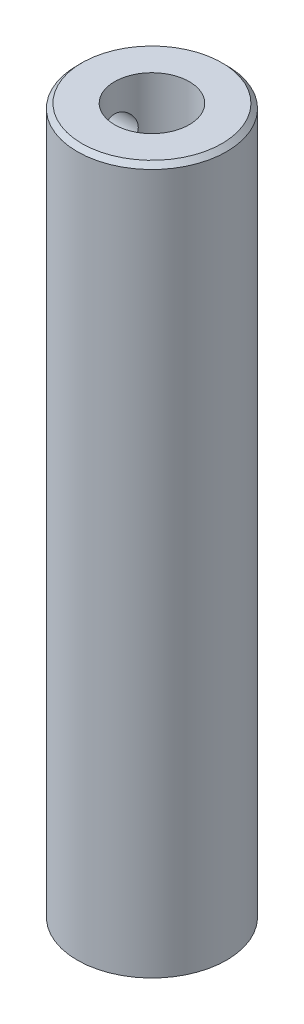
ISO-10303-21;
HEADER;
FILE_DESCRIPTION(('STEP AP214'),'2;1');
FILE_NAME('part.step','',(''),(''),'','','');
FILE_SCHEMA(('AUTOMOTIVE_DESIGN { 1 0 10303 214 1 1 1 1 }'));
ENDSEC;
DATA;
#1=APPLICATION_CONTEXT('core data for automotive mechanical design processes');
#2=APPLICATION_PROTOCOL_DEFINITION('international standard','automotive_design',2000,#1);
#3=PRODUCT_CONTEXT('',#1,'mechanical');
#4=PRODUCT('Part','Part','',(#3));
#5=PRODUCT_RELATED_PRODUCT_CATEGORY('part','',(#4));
#6=PRODUCT_DEFINITION_FORMATION('','',#4);
#7=PRODUCT_DEFINITION_CONTEXT('part definition',#1,'design');
#8=PRODUCT_DEFINITION('design','',#6,#7);
#9=PRODUCT_DEFINITION_SHAPE('','',#8);
#10=(LENGTH_UNIT() NAMED_UNIT(*) SI_UNIT(.MILLI.,.METRE.));
#11=(NAMED_UNIT(*) PLANE_ANGLE_UNIT() SI_UNIT($,.RADIAN.));
#12=(NAMED_UNIT(*) SI_UNIT($,.STERADIAN.) SOLID_ANGLE_UNIT());
#13=UNCERTAINTY_MEASURE_WITH_UNIT(LENGTH_MEASURE(1.E-05),#10,'distance_accuracy_value','');
#14=(GEOMETRIC_REPRESENTATION_CONTEXT(3) GLOBAL_UNCERTAINTY_ASSIGNED_CONTEXT((#13)) GLOBAL_UNIT_ASSIGNED_CONTEXT((#10,
#11,#12)) REPRESENTATION_CONTEXT('',''));
#15=CARTESIAN_POINT('',(0.,0.,0.));
#16=DIRECTION('',(0.,0.,1.));
#17=DIRECTION('',(1.,0.,0.));
#18=AXIS2_PLACEMENT_3D('',#15,#16,#17);
#19=CARTESIAN_POINT('',(0.,-75.5,0.));
#20=DIRECTION('',(0.,1.,0.));
#21=DIRECTION('',(0.,0.,1.));
#22=AXIS2_PLACEMENT_3D('',#19,#20,#21);
#23=CYLINDRICAL_SURFACE('',#22,8.);
#24=CARTESIAN_POINT('',(-7.74596669241483,-5.,-2.));
#25=CARTESIAN_POINT('',(-7.74596880070288,-5.11044060074126,-1.99999686287446));
#26=CARTESIAN_POINT('',(-7.74835444811678,-5.22091591894282,-1.99082099639812));
#27=CARTESIAN_POINT('',(-7.75761489594051,-5.43869406253881,-1.95441850037103));
#28=CARTESIAN_POINT('',(-7.76449230897304,-5.54599500357455,-1.92718136539368));
#29=CARTESIAN_POINT('',(-7.7819097967692,-5.75424283054975,-1.85559295970563));
#30=CARTESIAN_POINT('',(-7.79244514152366,-5.85519772430856,-1.81126378228359));
#31=CARTESIAN_POINT('',(-7.81598553623007,-6.0482486820319,-1.70681691300911));
#32=CARTESIAN_POINT('',(-7.82899069102791,-6.14034436966417,-1.64669855084855));
#33=CARTESIAN_POINT('',(-7.856325730845,-6.31508931620977,-1.51096674184951));
#34=CARTESIAN_POINT('',(-7.87067678098427,-6.39751488028004,-1.43506951016324));
#35=CARTESIAN_POINT('',(-7.89890300412235,-6.54860911548827,-1.27054565128053));
#36=CARTESIAN_POINT('',(-7.91277813253111,-6.6172765004974,-1.18191783534425));
#37=CARTESIAN_POINT('',(-7.93872332416466,-6.73982037410502,-0.992916160863163));
#38=CARTESIAN_POINT('',(-7.95076549920474,-6.79347711052917,-0.892395660956096));
#39=CARTESIAN_POINT('',(-7.97144649540787,-6.88304771532247,-0.68341054743421));
#40=CARTESIAN_POINT('',(-7.98008581867475,-6.91896420153241,-0.574947108633552));
#41=CARTESIAN_POINT('',(-7.99283807078544,-6.97131826766287,-0.355487007003329));
#42=CARTESIAN_POINT('',(-7.99703915075451,-6.98813571546127,-0.24458617563918));
#43=CARTESIAN_POINT('',(-8.00074875285838,-7.00300670342044,-0.0214630554102154));
#44=CARTESIAN_POINT('',(-8.00025796877363,-7.00106301776768,0.0907590356304548));
#45=CARTESIAN_POINT('',(-7.99470475962828,-6.97874011979988,0.310704494344774));
#46=CARTESIAN_POINT('',(-7.98974401872699,-6.95877093995692,0.418472431202134));
#47=CARTESIAN_POINT('',(-7.97592669219883,-6.9016229839612,0.629076494827372));
#48=CARTESIAN_POINT('',(-7.96706989918753,-6.86444329169807,0.731912358740875));
#49=CARTESIAN_POINT('',(-7.94630007760717,-6.77359794345035,0.930813407003613));
#50=CARTESIAN_POINT('',(-7.93436015756043,-6.7197863642706,1.02680901953301));
#51=CARTESIAN_POINT('',(-7.90871923047719,-6.59731545670699,1.20855124468098));
#52=CARTESIAN_POINT('',(-7.89501791721992,-6.5286535451515,1.29429607017101));
#53=CARTESIAN_POINT('',(-7.86690971015616,-6.3762330064141,1.45554807016991));
#54=CARTESIAN_POINT('',(-7.85249375620734,-6.29211608612178,1.5307153581504));
#55=CARTESIAN_POINT('',(-7.82492034813365,-6.1123200211678,1.66595275192604));
#56=CARTESIAN_POINT('',(-7.81176295284776,-6.0166403364072,1.72602215209203));
#57=CARTESIAN_POINT('',(-7.78816397465319,-5.81576797268083,1.8295762580452));
#58=CARTESIAN_POINT('',(-7.77773586980577,-5.71053141574944,1.87297913394098));
#59=CARTESIAN_POINT('',(-7.76094912111966,-5.49393162553884,1.94137124127268));
#60=CARTESIAN_POINT('',(-7.75458960648175,-5.38256970881349,1.96636441310582));
#61=CARTESIAN_POINT('',(-7.74684284831313,-5.1600323987815,1.99666371093214));
#62=CARTESIAN_POINT('',(-7.74532871274919,-5.0489297653363,2.0024723791357));
#63=CARTESIAN_POINT('',(-7.74709874784831,-4.82734245073747,1.99561359241244));
#64=CARTESIAN_POINT('',(-7.75038247681013,-4.71685771363901,1.98294783827904));
#65=CARTESIAN_POINT('',(-7.76125665563648,-4.50150858803624,1.93994037115013));
#66=CARTESIAN_POINT('',(-7.768775761875,-4.39658181874332,1.9098912546254));
#67=CARTESIAN_POINT('',(-7.7872057461677,-4.19325483371865,1.8332944653365));
#68=CARTESIAN_POINT('',(-7.79811702598891,-4.09485539275573,1.78674483817004));
#69=CARTESIAN_POINT('',(-7.8223690967461,-3.90524697770612,1.67741653434925));
#70=CARTESIAN_POINT('',(-7.83575334885313,-3.81421692796552,1.6143374030685));
#71=CARTESIAN_POINT('',(-7.86333666457373,-3.64384930975892,1.47412058586891));
#72=CARTESIAN_POINT('',(-7.87753586182776,-3.56451366667994,1.39698058961088));
#73=CARTESIAN_POINT('',(-7.90557922425285,-3.41775116594323,1.22852544196945));
#74=CARTESIAN_POINT('',(-7.91940561649468,-3.35067194996095,1.13690390506318));
#75=CARTESIAN_POINT('',(-7.94477773290987,-3.23285130643901,0.94340536538935));
#76=CARTESIAN_POINT('',(-7.95632357603169,-3.18210902671344,0.841528897915181));
#77=CARTESIAN_POINT('',(-7.9757609259065,-3.09884317237765,0.631116403462181));
#78=CARTESIAN_POINT('',(-7.98367864017925,-3.06618857249675,0.522634762055764));
#79=CARTESIAN_POINT('',(-7.99508234716634,-3.01963173231327,0.301499520637614));
#80=CARTESIAN_POINT('',(-7.99856919514738,-3.00572587300877,0.188846730082481));
#81=CARTESIAN_POINT('',(-8.00068338817612,-2.99726482084892,-0.034167052886646));
#82=CARTESIAN_POINT('',(-7.99943957759977,-3.00219658180918,-0.144507653932043));
#83=CARTESIAN_POINT('',(-7.99251792914887,-3.0300956545887,-0.362734992829501));
#84=CARTESIAN_POINT('',(-7.98684022314338,-3.05306243002634,-0.470621803561857));
#85=CARTESIAN_POINT('',(-7.97170865707778,-3.11610443954172,-0.680342071289548));
#86=CARTESIAN_POINT('',(-7.96227529004785,-3.15608690662876,-0.782204989161726));
#87=CARTESIAN_POINT('',(-7.94062577827316,-3.25194115803914,-0.977834106083248));
#88=CARTESIAN_POINT('',(-7.92840928277515,-3.30781494534097,-1.07159928253127));
#89=CARTESIAN_POINT('',(-7.90214499360574,-3.43543046799227,-1.25080385684661));
#90=CARTESIAN_POINT('',(-7.88806033883329,-3.50752028580766,-1.33598997659667));
#91=CARTESIAN_POINT('',(-7.85981298114379,-3.66484570395469,-1.49323004054701));
#92=CARTESIAN_POINT('',(-7.84565025934604,-3.75008463222233,-1.56528065015318));
#93=CARTESIAN_POINT('',(-7.81854951691005,-3.93320282837892,-1.69552405294366));
#94=CARTESIAN_POINT('',(-7.80563927346578,-4.03128824673051,-1.75343323883276));
#95=CARTESIAN_POINT('',(-7.78287910989656,-4.23611097974964,-1.85185379317094));
#96=CARTESIAN_POINT('',(-7.77302696466427,-4.34284193218769,-1.8923778195043));
#97=CARTESIAN_POINT('',(-7.75903817501475,-4.54115402367032,-1.94884505714201));
#98=CARTESIAN_POINT('',(-7.75417326006998,-4.63178632877228,-1.96798634119376));
#99=CARTESIAN_POINT('',(-7.7476367716524,-4.81493773799538,-1.99356458514354));
#100=CARTESIAN_POINT('',(-7.74596492578215,-4.90745668048881,-2.0000026287435));
#101=CARTESIAN_POINT('',(-7.74596669241483,-5.,-2.));
#102=B_SPLINE_CURVE_WITH_KNOTS('',3,(#24,#25,#26,#27,#28,#29,#30,#31,#32,#33,#34,#35,#36,#37,
#38,#39,#40,#41,#42,#43,#44,#45,#46,#47,#48,#49,#50,#51,#52,#53,#54,#55,#56,#57,#58,#59,#60,#61,
#62,#63,#64,#65,#66,#67,#68,#69,#70,#71,#72,#73,#74,#75,#76,#77,#78,#79,#80,#81,#82,#83,#84,#85,
#86,#87,#88,#89,#90,#91,#92,#93,#94,#95,#96,#97,#98,#99,#100,#101),.UNSPECIFIED.,.T.,.F.,(4,2,2,
2,2,2,2,2,2,2,2,2,2,2,2,2,2,2,2,2,2,2,2,2,2,2,2,2,2,2,2,2,2,2,2,2,2,2,4),(0.,0.330981953388909,
0.662156593142932,0.992904581732815,1.32366661404383,1.66099163354381,1.99834817183893,
2.34041197118336,2.68242527877674,3.01751000796277,3.35254518932816,3.68014610151158,
4.00776445379829,4.33834299403556,4.66897908375131,5.00856373257529,5.34816424959842,
5.68941145606722,6.03058560103638,6.36274859809374,6.69488101747042,7.02157924007366,
7.34831617137134,7.68146276687326,8.01466415108036,8.35620264772255,8.69772332575643,
9.03673658245543,9.37568439127231,9.70546756901965,10.0352409390158,10.3632390124777,
10.6912784459046,11.0271767726566,11.3631602525241,11.7054118182895,12.0474137709606,
12.3247826174462,12.6021278008238),.UNSPECIFIED.);
#103=CARTESIAN_POINT('',(-7.74596669241483,-5.,-2.));
#104=VERTEX_POINT('',#103);
#105=EDGE_CURVE('E59',#104,#104,#102,.T.);
#106=ORIENTED_EDGE('',*,*,#105,.F.);
#107=EDGE_LOOP('',(#106));
#108=FACE_BOUND('',#107,.T.);
#109=CARTESIAN_POINT('',(0.,-0.500000000000014,0.));
#110=DIRECTION('',(0.,1.,0.));
#111=DIRECTION('',(0.,0.,1.));
#112=AXIS2_PLACEMENT_3D('',#109,#110,#111);
#113=CIRCLE('',#112,8.);
#114=CARTESIAN_POINT('',(0.,-0.500000000000014,8.));
#115=VERTEX_POINT('',#114);
#116=EDGE_CURVE('E10',#115,#115,#113,.F.);
#117=ORIENTED_EDGE('',*,*,#116,.T.);
#118=EDGE_LOOP('',(#117));
#119=FACE_BOUND('',#118,.T.);
#120=CARTESIAN_POINT('',(0.,-75.5,0.));
#121=DIRECTION('',(0.,1.,0.));
#122=DIRECTION('',(0.,0.,1.));
#123=AXIS2_PLACEMENT_3D('',#120,#121,#122);
#124=CIRCLE('',#123,8.);
#125=CARTESIAN_POINT('',(0.,-75.5,8.));
#126=VERTEX_POINT('',#125);
#127=EDGE_CURVE('E50',#126,#126,#124,.T.);
#128=ORIENTED_EDGE('',*,*,#127,.T.);
#129=EDGE_LOOP('',(#128));
#130=FACE_BOUND('',#129,.T.);
#131=ADVANCED_FACE('F32',(#108,#119,#130),#23,.T.);
#132=CARTESIAN_POINT('',(0.,-75.5,0.));
#133=DIRECTION('',(0.,1.,0.));
#134=DIRECTION('',(0.,0.,1.));
#135=AXIS2_PLACEMENT_3D('',#132,#133,#134);
#136=PLANE('',#135);
#137=ORIENTED_EDGE('',*,*,#127,.F.);
#138=EDGE_LOOP('',(#137));
#139=FACE_BOUND('',#138,.T.);
#140=ADVANCED_FACE('F82',(#139),#136,.F.);
#141=CARTESIAN_POINT('',(0.,0.,0.));
#142=DIRECTION('',(0.,1.,0.));
#143=DIRECTION('',(0.,0.,1.));
#144=AXIS2_PLACEMENT_3D('',#141,#142,#143);
#145=PLANE('',#144);
#146=CARTESIAN_POINT('',(0.,0.,0.));
#147=DIRECTION('',(0.,1.,0.));
#148=DIRECTION('',(0.,0.,1.));
#149=AXIS2_PLACEMENT_3D('',#146,#147,#148);
#150=CIRCLE('',#149,4.);
#151=CARTESIAN_POINT('',(0.,0.,4.));
#152=VERTEX_POINT('',#151);
#153=EDGE_CURVE('E56',#152,#152,#150,.T.);
#154=ORIENTED_EDGE('',*,*,#153,.F.);
#155=EDGE_LOOP('',(#154));
#156=FACE_BOUND('',#155,.T.);
#157=CARTESIAN_POINT('',(0.,0.,0.));
#158=DIRECTION('',(0.,1.,0.));
#159=DIRECTION('',(0.,0.,1.));
#160=AXIS2_PLACEMENT_3D('',#157,#158,#159);
#161=CIRCLE('',#160,7.49999999999999);
#162=CARTESIAN_POINT('',(0.,0.,7.49999999999999));
#163=VERTEX_POINT('',#162);
#164=EDGE_CURVE('E46',#163,#163,#161,.T.);
#165=ORIENTED_EDGE('',*,*,#164,.T.);
#166=EDGE_LOOP('',(#165));
#167=FACE_BOUND('',#166,.T.);
#168=ADVANCED_FACE('F84',(#156,#167),#145,.T.);
#169=CARTESIAN_POINT('',(0.,0.,0.));
#170=DIRECTION('',(0.,-1.,0.));
#171=DIRECTION('',(0.,0.,-1.));
#172=AXIS2_PLACEMENT_3D('',#169,#170,#171);
#173=CONICAL_SURFACE('',#172,7.49999999999999,0.785398163397441);
#174=ORIENTED_EDGE('',*,*,#116,.F.);
#175=EDGE_LOOP('',(#174));
#176=FACE_BOUND('',#175,.T.);
#177=ORIENTED_EDGE('',*,*,#164,.F.);
#178=EDGE_LOOP('',(#177));
#179=FACE_BOUND('',#178,.T.);
#180=ADVANCED_FACE('F35',(#176,#179),#173,.T.);
#181=CARTESIAN_POINT('',(0.,-23.,0.));
#182=DIRECTION('',(0.,1.,0.));
#183=DIRECTION('',(0.,0.,1.));
#184=AXIS2_PLACEMENT_3D('',#181,#182,#183);
#185=CYLINDRICAL_SURFACE('',#184,4.);
#186=CARTESIAN_POINT('',(-3.46410161513775,-5.,-2.));
#187=CARTESIAN_POINT('',(-3.46411185715888,-5.10421320547434,-1.99999158748781));
#188=CARTESIAN_POINT('',(-3.46887633544978,-5.2085621765338,-1.99179963610437));
#189=CARTESIAN_POINT('',(-3.48724701669072,-5.4140551772306,-1.95944672580053));
#190=CARTESIAN_POINT('',(-3.50087179788183,-5.51519200324776,-1.93525221095662));
#191=CARTESIAN_POINT('',(-3.53498701490002,-5.71090315644693,-1.8721998159803));
#192=CARTESIAN_POINT('',(-3.55544089069169,-5.80550925884925,-1.83341988295963));
#193=CARTESIAN_POINT('',(-3.60085327291133,-5.98684845047615,-1.74253507245138));
#194=CARTESIAN_POINT('',(-3.62581202301253,-6.07358111343677,-1.69042947410139));
#195=CARTESIAN_POINT('',(-3.67993738819289,-6.24461144313338,-1.569333074538));
#196=CARTESIAN_POINT('',(-3.70928127465103,-6.32811826759177,-1.49930407053533));
#197=CARTESIAN_POINT('',(-3.76743965382121,-6.4828167805706,-1.34650761698202));
#198=CARTESIAN_POINT('',(-3.79625387610258,-6.55400232620397,-1.26373385204841));
#199=CARTESIAN_POINT('',(-3.85242953961661,-6.6867343011885,-1.08097912631265));
#200=CARTESIAN_POINT('',(-3.87956212851245,-6.74730753542331,-0.980214377887153));
#201=CARTESIAN_POINT('',(-3.92701512184167,-6.85028170678709,-0.768314053336917));
#202=CARTESIAN_POINT('',(-3.94733982363631,-6.8926941123508,-0.657185076311985));
#203=CARTESIAN_POINT('',(-3.97760922492053,-6.95500932253118,-0.436089887818817));
#204=CARTESIAN_POINT('',(-3.9881896044274,-6.9762990526921,-0.326603580968785));
#205=CARTESIAN_POINT('',(-4.00015167691179,-7.00033223736903,-0.10514125740454));
#206=CARTESIAN_POINT('',(-4.00153893568935,-7.00308691359628,0.0068332116852082));
#207=CARTESIAN_POINT('',(-3.99525963833124,-6.99050665205486,0.219665048849573));
#208=CARTESIAN_POINT('',(-3.98836991784381,-6.97672396895636,0.320642398354139));
#209=CARTESIAN_POINT('',(-3.96748490519435,-6.93423831219188,0.518627543836089));
#210=CARTESIAN_POINT('',(-3.95348908132771,-6.90553422204788,0.615635042187702));
#211=CARTESIAN_POINT('',(-3.91943166575325,-6.83383486782005,0.80461878313926));
#212=CARTESIAN_POINT('',(-3.89928883058403,-6.79064737365578,0.896506847030398));
#213=CARTESIAN_POINT('',(-3.8547529197337,-6.6914731675971,1.07195360302662));
#214=CARTESIAN_POINT('',(-3.83035832314967,-6.63548187339532,1.15550929767728));
#215=CARTESIAN_POINT('',(-3.7768878879846,-6.50620929693394,1.3203473217964));
#216=CARTESIAN_POINT('',(-3.7475875199635,-6.43179394334797,1.40066815005873));
#217=CARTESIAN_POINT('',(-3.68908681173623,-6.27082055013965,1.54820874059556));
#218=CARTESIAN_POINT('',(-3.65988656531257,-6.18425325545188,1.61541842314846));
#219=CARTESIAN_POINT('',(-3.60288312184969,-5.99470361515182,1.73901066928442));
#220=CARTESIAN_POINT('',(-3.57528639981415,-5.89102795389158,1.7944346299561));
#221=CARTESIAN_POINT('',(-3.52750900557152,-5.674124657282,1.88663822600246));
#222=CARTESIAN_POINT('',(-3.50732060092135,-5.56090713396487,1.92343731642178));
#223=CARTESIAN_POINT('',(-3.47889271634069,-5.33757097743442,1.97436042205008));
#224=CARTESIAN_POINT('',(-3.46983311696993,-5.2279177619129,1.99005024423995));
#225=CARTESIAN_POINT('',(-3.46235838723219,-5.00719731696691,2.00303389322285));
#226=CARTESIAN_POINT('',(-3.46393573778623,-4.8961311417604,2.00034071463005));
#227=CARTESIAN_POINT('',(-3.4766867308117,-4.68869216284256,1.97807208668793));
#228=CARTESIAN_POINT('',(-3.48679175013308,-4.59204109778421,1.96037563342492));
#229=CARTESIAN_POINT('',(-3.51388043102682,-4.40326442745801,1.91139256926489));
#230=CARTESIAN_POINT('',(-3.53086632010068,-4.31114029850652,1.88010155724726));
#231=CARTESIAN_POINT('',(-3.57072444159313,-4.12917733819488,1.80329517720973));
#232=CARTESIAN_POINT('',(-3.59383286486126,-4.03964196629395,1.7571881273853));
#233=CARTESIAN_POINT('',(-3.643122389945,-3.86906145692096,1.65257412803176));
#234=CARTESIAN_POINT('',(-3.66930506710298,-3.78802071296949,1.59406080866498));
#235=CARTESIAN_POINT('',(-3.72575996912669,-3.62604246495734,1.45767433439708));
#236=CARTESIAN_POINT('',(-3.75613166308566,-3.54640569858222,1.37829054462747));
#237=CARTESIAN_POINT('',(-3.81468469955797,-3.40117552399527,1.20680899079903));
#238=CARTESIAN_POINT('',(-3.84286530015463,-3.33558685947316,1.11470694931991));
#239=CARTESIAN_POINT('',(-3.89482723381868,-3.21885254816729,0.917070725108057));
#240=CARTESIAN_POINT('',(-3.91847283343884,-3.16813376383323,0.811246195112492));
#241=CARTESIAN_POINT('',(-3.95766709918776,-3.08572419203039,0.591044729317862));
#242=CARTESIAN_POINT('',(-3.97322287353397,-3.0540166963159,0.476675402917651));
#243=CARTESIAN_POINT('',(-3.99335016363174,-3.01326287251486,0.253959364539762));
#244=CARTESIAN_POINT('',(-3.9987985581427,-3.00240425133572,0.146022887268299));
#245=CARTESIAN_POINT('',(-4.00084260752374,-2.99831346600433,-0.0702519714699469));
#246=CARTESIAN_POINT('',(-3.99744136141634,-3.00507513147113,-0.178590198981615));
#247=CARTESIAN_POINT('',(-3.98267937668509,-3.03483282431641,-0.38507598613686));
#248=CARTESIAN_POINT('',(-3.97185789309443,-3.05672973730905,-0.48342464105742));
#249=CARTESIAN_POINT('',(-3.94384187353387,-3.11465395980667,-0.674891898931566));
#250=CARTESIAN_POINT('',(-3.92664642364424,-3.15068329570691,-0.768009749669773));
#251=CARTESIAN_POINT('',(-3.8865186139318,-3.2374542549914,-0.950846833596742));
#252=CARTESIAN_POINT('',(-3.86337234005403,-3.28875921975186,-1.0402503657229));
#253=CARTESIAN_POINT('',(-3.81376266676027,-3.4039152881181,-1.20954920326828));
#254=CARTESIAN_POINT('',(-3.78729774583427,-3.46777215410157,-1.28944011444319));
#255=CARTESIAN_POINT('',(-3.73057218840582,-3.61359663555941,-1.44582833859495));
#256=CARTESIAN_POINT('',(-3.70019591726075,-3.69673418080029,-1.52119665879199));
#257=CARTESIAN_POINT('',(-3.64126158628571,-3.87489222830609,-1.65732528394006));
#258=CARTESIAN_POINT('',(-3.61270515130784,-3.96992313136052,-1.71807266521244));
#259=CARTESIAN_POINT('',(-3.55999186256751,-4.17330889413025,-1.82486714716811));
#260=CARTESIAN_POINT('',(-3.53600256268535,-4.28198991073527,-1.87038902381914));
#261=CARTESIAN_POINT('',(-3.5069621813237,-4.45057811963095,-1.92395929504801));
#262=CARTESIAN_POINT('',(-3.49844389329401,-4.50764782059068,-1.93935666147967));
#263=CARTESIAN_POINT('',(-3.48406059323535,-4.62323255750019,-1.96508069805043));
#264=CARTESIAN_POINT('',(-3.47819372636051,-4.68174655275425,-1.97541091343282));
#265=CARTESIAN_POINT('',(-3.47059023668758,-4.78360078924729,-1.9887293296122));
#266=CARTESIAN_POINT('',(-3.46816389731816,-4.82673305725007,-1.99295091983786));
#267=CARTESIAN_POINT('',(-3.46491740045177,-4.9132356930929,-1.99858810035606));
#268=CARTESIAN_POINT('',(-3.46409735040492,-4.9566060766667,-2.00000350293331));
#269=CARTESIAN_POINT('',(-3.46410161513775,-5.,-2.));
#270=B_SPLINE_CURVE_WITH_KNOTS('',3,(#186,#187,#188,#189,#190,#191,#192,#193,#194,#195,#196,
#197,#198,#199,#200,#201,#202,#203,#204,#205,#206,#207,#208,#209,#210,#211,#212,#213,#214,#215,
#216,#217,#218,#219,#220,#221,#222,#223,#224,#225,#226,#227,#228,#229,#230,#231,#232,#233,#234,
#235,#236,#237,#238,#239,#240,#241,#242,#243,#244,#245,#246,#247,#248,#249,#250,#251,#252,#253,
#254,#255,#256,#257,#258,#259,#260,#261,#262,#263,#264,#265,#266,#267,#268,#269),.UNSPECIFIED.,
.T.,.F.,(4,2,2,2,2,2,2,2,2,2,2,2,2,2,2,2,2,2,2,2,2,2,2,2,2,2,2,2,2,2,2,2,2,2,2,2,2,2,2,2,2,4),
(0.,0.312464245189432,0.62558578564961,0.937057191861536,1.24854545093096,1.58572462503713,
1.92307142172809,2.28315784481594,2.64301653931849,2.97726969939937,3.31132047376147,
3.61632194973143,3.92134625038977,4.2305906946636,4.5399459870461,4.87854382917848,
5.21740096495904,5.57777683462964,5.93777548427477,6.2692458171249,6.60048186380813,
6.89548366852118,7.19058104876193,7.49934592816242,7.80826972444161,8.15613487165293,
8.50411729960471,8.86128362829998,9.2181355962161,9.5422454078304,9.8662417359201,
10.1688884974705,10.4715786702809,10.7872150144301,11.1029966020551,11.450204837042,
11.7977188569438,12.1562149808128,12.3351395323571,12.5139387197526,12.6440387634036,
12.7741475095882),.UNSPECIFIED.);
#271=CARTESIAN_POINT('',(-3.46410161513775,-5.,-2.));
#272=VERTEX_POINT('',#271);
#273=EDGE_CURVE('E37',#272,#272,#270,.T.);
#274=ORIENTED_EDGE('',*,*,#273,.T.);
#275=EDGE_LOOP('',(#274));
#276=FACE_BOUND('',#275,.T.);
#277=CARTESIAN_POINT('',(0.,-23.,0.));
#278=DIRECTION('',(0.,1.,0.));
#279=DIRECTION('',(0.,0.,1.));
#280=AXIS2_PLACEMENT_3D('',#277,#278,#279);
#281=CIRCLE('',#280,4.);
#282=CARTESIAN_POINT('',(0.,-23.,4.));
#283=VERTEX_POINT('',#282);
#284=EDGE_CURVE('E55',#283,#283,#281,.T.);
#285=ORIENTED_EDGE('',*,*,#284,.F.);
#286=EDGE_LOOP('',(#285));
#287=FACE_BOUND('',#286,.T.);
#288=ORIENTED_EDGE('',*,*,#153,.T.);
#289=EDGE_LOOP('',(#288));
#290=FACE_BOUND('',#289,.T.);
#291=ADVANCED_FACE('F76',(#276,#287,#290),#185,.F.);
#292=CARTESIAN_POINT('',(0.,-23.,0.));
#293=DIRECTION('',(0.,1.,0.));
#294=DIRECTION('',(0.,0.,1.));
#295=AXIS2_PLACEMENT_3D('',#292,#293,#294);
#296=PLANE('',#295);
#297=ORIENTED_EDGE('',*,*,#284,.T.);
#298=EDGE_LOOP('',(#297));
#299=FACE_BOUND('',#298,.T.);
#300=ADVANCED_FACE('F72',(#299),#296,.T.);
#301=CARTESIAN_POINT('',(-23.,-5.,0.));
#302=DIRECTION('',(1.,0.,0.));
#303=DIRECTION('',(0.,0.,-1.));
#304=AXIS2_PLACEMENT_3D('',#301,#302,#303);
#305=CYLINDRICAL_SURFACE('',#304,2.);
#306=ORIENTED_EDGE('',*,*,#105,.T.);
#307=EDGE_LOOP('',(#306));
#308=FACE_BOUND('',#307,.T.);
#309=ORIENTED_EDGE('',*,*,#273,.F.);
#310=EDGE_LOOP('',(#309));
#311=FACE_BOUND('',#310,.T.);
#312=ADVANCED_FACE('F68',(#308,#311),#305,.F.);
#313=CLOSED_SHELL('',(#131,#140,#168,#180,#291,#300,#312));
#314=MANIFOLD_SOLID_BREP('B2',#313);
#315=ADVANCED_BREP_SHAPE_REPRESENTATION('',(#18,#314),#14);
#316=SHAPE_DEFINITION_REPRESENTATION(#9,#315);
ENDSEC;
END-ISO-10303-21;
